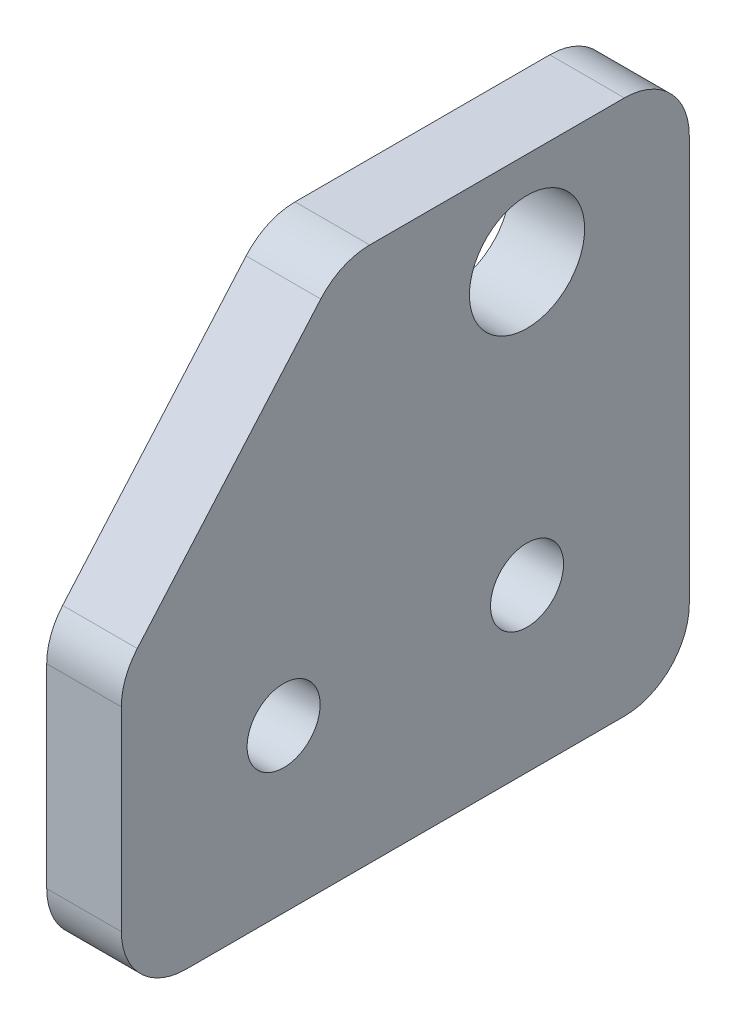
ISO-10303-21;
HEADER;
FILE_DESCRIPTION(('STEP AP214'),'2;1');
FILE_NAME('part.step','',(''),(''),'','','');
FILE_SCHEMA(('AUTOMOTIVE_DESIGN { 1 0 10303 214 1 1 1 1 }'));
ENDSEC;
DATA;
#1=APPLICATION_CONTEXT('core data for automotive mechanical design processes');
#2=APPLICATION_PROTOCOL_DEFINITION('international standard','automotive_design',2000,#1);
#3=PRODUCT_CONTEXT('',#1,'mechanical');
#4=PRODUCT('Part','Part','',(#3));
#5=PRODUCT_RELATED_PRODUCT_CATEGORY('part','',(#4));
#6=PRODUCT_DEFINITION_FORMATION('','',#4);
#7=PRODUCT_DEFINITION_CONTEXT('part definition',#1,'design');
#8=PRODUCT_DEFINITION('design','',#6,#7);
#9=PRODUCT_DEFINITION_SHAPE('','',#8);
#10=(LENGTH_UNIT() NAMED_UNIT(*) SI_UNIT(.MILLI.,.METRE.));
#11=(NAMED_UNIT(*) PLANE_ANGLE_UNIT() SI_UNIT($,.RADIAN.));
#12=(NAMED_UNIT(*) SI_UNIT($,.STERADIAN.) SOLID_ANGLE_UNIT());
#13=UNCERTAINTY_MEASURE_WITH_UNIT(LENGTH_MEASURE(1.E-05),#10,'distance_accuracy_value','');
#14=(GEOMETRIC_REPRESENTATION_CONTEXT(3) GLOBAL_UNCERTAINTY_ASSIGNED_CONTEXT((#13)) GLOBAL_UNIT_ASSIGNED_CONTEXT((#10,
#11,#12)) REPRESENTATION_CONTEXT('',''));
#15=CARTESIAN_POINT('',(0.,0.,0.));
#16=DIRECTION('',(0.,0.,1.));
#17=DIRECTION('',(1.,0.,0.));
#18=AXIS2_PLACEMENT_3D('',#15,#16,#17);
#19=CARTESIAN_POINT('',(4.6,-6.,21.));
#20=DIRECTION('',(1.,0.,0.));
#21=DIRECTION('',(0.,0.,-1.));
#22=AXIS2_PLACEMENT_3D('',#19,#20,#21);
#23=PLANE('',#22);
#24=CARTESIAN_POINT('',(4.6,17.25,0.));
#25=DIRECTION('',(1.,0.,0.));
#26=DIRECTION('',(0.,0.,-1.));
#27=AXIS2_PLACEMENT_3D('',#24,#25,#26);
#28=CIRCLE('',#27,3.55);
#29=CARTESIAN_POINT('',(4.6,17.25,-3.55));
#30=VERTEX_POINT('',#29);
#31=EDGE_CURVE('E249',#30,#30,#28,.T.);
#32=ORIENTED_EDGE('',*,*,#31,.F.);
#33=EDGE_LOOP('',(#32));
#34=FACE_BOUND('',#33,.T.);
#35=CARTESIAN_POINT('',(4.6,-6.,21.));
#36=DIRECTION('',(1.,0.,0.));
#37=DIRECTION('',(0.,0.,-1.));
#38=AXIS2_PLACEMENT_3D('',#35,#36,#37);
#39=CIRCLE('',#38,4.);
#40=CARTESIAN_POINT('',(4.6,-6.,25.));
#41=VERTEX_POINT('',#40);
#42=CARTESIAN_POINT('',(4.6,-10.,21.));
#43=VERTEX_POINT('',#42);
#44=EDGE_CURVE('E182',#41,#43,#39,.T.);
#45=ORIENTED_EDGE('',*,*,#44,.T.);
#46=DIRECTION('',(0.,0.,-1.));
#47=VECTOR('',#46,1.);
#48=CARTESIAN_POINT('',(4.6,-10.,21.));
#49=LINE('',#48,#47);
#50=CARTESIAN_POINT('',(4.6,-10.,-6.));
#51=VERTEX_POINT('',#50);
#52=EDGE_CURVE('E106',#43,#51,#49,.T.);
#53=ORIENTED_EDGE('',*,*,#52,.T.);
#54=CARTESIAN_POINT('',(4.6,-6.,-6.));
#55=DIRECTION('',(1.,0.,0.));
#56=DIRECTION('',(0.,0.,-1.));
#57=AXIS2_PLACEMENT_3D('',#54,#55,#56);
#58=CIRCLE('',#57,4.);
#59=CARTESIAN_POINT('',(4.6,-6.,-10.));
#60=VERTEX_POINT('',#59);
#61=EDGE_CURVE('E211',#51,#60,#58,.T.);
#62=ORIENTED_EDGE('',*,*,#61,.T.);
#63=DIRECTION('',(0.,1.,0.));
#64=VECTOR('',#63,1.);
#65=CARTESIAN_POINT('',(4.6,-6.,-10.));
#66=LINE('',#65,#64);
#67=CARTESIAN_POINT('',(4.6,19.,-10.));
#68=VERTEX_POINT('',#67);
#69=EDGE_CURVE('E231',#60,#68,#66,.T.);
#70=ORIENTED_EDGE('',*,*,#69,.T.);
#71=CARTESIAN_POINT('',(4.6,19.,-6.));
#72=DIRECTION('',(1.,0.,0.));
#73=DIRECTION('',(0.,0.,-1.));
#74=AXIS2_PLACEMENT_3D('',#71,#72,#73);
#75=CIRCLE('',#74,4.);
#76=CARTESIAN_POINT('',(4.6,23.,-6.));
#77=VERTEX_POINT('',#76);
#78=EDGE_CURVE('E227',#68,#77,#75,.T.);
#79=ORIENTED_EDGE('',*,*,#78,.T.);
#80=DIRECTION('',(0.,0.,1.));
#81=VECTOR('',#80,1.);
#82=CARTESIAN_POINT('',(4.6,23.,-6.));
#83=LINE('',#82,#81);
#84=CARTESIAN_POINT('',(4.6,23.,9.69565217391305));
#85=VERTEX_POINT('',#84);
#86=EDGE_CURVE('E230',#77,#85,#83,.T.);
#87=ORIENTED_EDGE('',*,*,#86,.T.);
#88=CARTESIAN_POINT('',(4.6,19.,9.69565217391305));
#89=DIRECTION('',(1.,0.,0.));
#90=DIRECTION('',(0.,0.,-1.));
#91=AXIS2_PLACEMENT_3D('',#88,#89,#90);
#92=CIRCLE('',#91,4.);
#93=CARTESIAN_POINT('',(4.6,21.6247148596991,12.7140742625671));
#94=VERTEX_POINT('',#93);
#95=EDGE_CURVE('E131',#85,#94,#92,.T.);
#96=ORIENTED_EDGE('',*,*,#95,.T.);
#97=DIRECTION('',(0.,-0.754605522163505,0.656178714924786));
#98=VECTOR('',#97,1.);
#99=CARTESIAN_POINT('',(4.6,21.6247148596991,12.7140742625671));
#100=LINE('',#99,#98);
#101=CARTESIAN_POINT('',(4.6,8.62471485969914,24.018422088654));
#102=VERTEX_POINT('',#101);
#103=EDGE_CURVE('E125',#94,#102,#100,.T.);
#104=ORIENTED_EDGE('',*,*,#103,.T.);
#105=CARTESIAN_POINT('',(4.6,5.99999999999999,21.));
#106=DIRECTION('',(1.,0.,0.));
#107=DIRECTION('',(0.,0.,-1.));
#108=AXIS2_PLACEMENT_3D('',#105,#106,#107);
#109=CIRCLE('',#108,4.);
#110=CARTESIAN_POINT('',(4.6,5.99999999999999,25.));
#111=VERTEX_POINT('',#110);
#112=EDGE_CURVE('E129',#102,#111,#109,.T.);
#113=ORIENTED_EDGE('',*,*,#112,.T.);
#114=DIRECTION('',(0.,-1.,0.));
#115=VECTOR('',#114,1.);
#116=CARTESIAN_POINT('',(4.6,5.99999999999999,25.));
#117=LINE('',#116,#115);
#118=EDGE_CURVE('E57',#111,#41,#117,.T.);
#119=ORIENTED_EDGE('',*,*,#118,.T.);
#120=EDGE_LOOP('',(#45,#53,#62,#70,#79,#87,#96,#104,#113,#119));
#121=FACE_BOUND('',#120,.T.);
#122=CARTESIAN_POINT('',(4.6,0.,15.));
#123=DIRECTION('',(1.,0.,0.));
#124=DIRECTION('',(0.,0.,-1.));
#125=AXIS2_PLACEMENT_3D('',#122,#123,#124);
#126=CIRCLE('',#125,2.25);
#127=CARTESIAN_POINT('',(4.6,0.,12.75));
#128=VERTEX_POINT('',#127);
#129=EDGE_CURVE('E158',#128,#128,#126,.T.);
#130=ORIENTED_EDGE('',*,*,#129,.F.);
#131=EDGE_LOOP('',(#130));
#132=FACE_BOUND('',#131,.T.);
#133=CARTESIAN_POINT('',(4.6,0.,0.));
#134=DIRECTION('',(1.,0.,0.));
#135=DIRECTION('',(0.,0.,-1.));
#136=AXIS2_PLACEMENT_3D('',#133,#134,#135);
#137=CIRCLE('',#136,2.25);
#138=CARTESIAN_POINT('',(4.6,0.,-2.25));
#139=VERTEX_POINT('',#138);
#140=EDGE_CURVE('E257',#139,#139,#137,.T.);
#141=ORIENTED_EDGE('',*,*,#140,.F.);
#142=EDGE_LOOP('',(#141));
#143=FACE_BOUND('',#142,.T.);
#144=ADVANCED_FACE('F39',(#34,#121,#132,#143),#23,.T.);
#145=CARTESIAN_POINT('',(0.,-6.,21.));
#146=DIRECTION('',(1.,0.,0.));
#147=DIRECTION('',(0.,0.,-1.));
#148=AXIS2_PLACEMENT_3D('',#145,#146,#147);
#149=PLANE('',#148);
#150=CARTESIAN_POINT('',(0.,-6.,21.));
#151=DIRECTION('',(1.,0.,0.));
#152=DIRECTION('',(0.,0.,-1.));
#153=AXIS2_PLACEMENT_3D('',#150,#151,#152);
#154=CIRCLE('',#153,4.);
#155=CARTESIAN_POINT('',(0.,-6.,25.));
#156=VERTEX_POINT('',#155);
#157=CARTESIAN_POINT('',(0.,-10.,21.));
#158=VERTEX_POINT('',#157);
#159=EDGE_CURVE('E153',#156,#158,#154,.T.);
#160=ORIENTED_EDGE('',*,*,#159,.F.);
#161=DIRECTION('',(0.,-1.,0.));
#162=VECTOR('',#161,1.);
#163=CARTESIAN_POINT('',(0.,5.99999999999999,25.));
#164=LINE('',#163,#162);
#165=CARTESIAN_POINT('',(0.,5.99999999999999,25.));
#166=VERTEX_POINT('',#165);
#167=EDGE_CURVE('E98',#166,#156,#164,.T.);
#168=ORIENTED_EDGE('',*,*,#167,.F.);
#169=CARTESIAN_POINT('',(0.,5.99999999999999,21.));
#170=DIRECTION('',(1.,0.,0.));
#171=DIRECTION('',(0.,0.,-1.));
#172=AXIS2_PLACEMENT_3D('',#169,#170,#171);
#173=CIRCLE('',#172,4.);
#174=CARTESIAN_POINT('',(0.,8.62471485969914,24.018422088654));
#175=VERTEX_POINT('',#174);
#176=EDGE_CURVE('E92',#175,#166,#173,.T.);
#177=ORIENTED_EDGE('',*,*,#176,.F.);
#178=DIRECTION('',(0.,-0.754605522163505,0.656178714924786));
#179=VECTOR('',#178,1.);
#180=CARTESIAN_POINT('',(0.,21.6247148596991,12.7140742625671));
#181=LINE('',#180,#179);
#182=CARTESIAN_POINT('',(0.,21.6247148596991,12.7140742625671));
#183=VERTEX_POINT('',#182);
#184=EDGE_CURVE('E140',#183,#175,#181,.T.);
#185=ORIENTED_EDGE('',*,*,#184,.F.);
#186=CARTESIAN_POINT('',(0.,19.,9.69565217391305));
#187=DIRECTION('',(1.,0.,0.));
#188=DIRECTION('',(0.,0.,-1.));
#189=AXIS2_PLACEMENT_3D('',#186,#187,#188);
#190=CIRCLE('',#189,4.);
#191=CARTESIAN_POINT('',(0.,23.,9.69565217391305));
#192=VERTEX_POINT('',#191);
#193=EDGE_CURVE('E173',#192,#183,#190,.T.);
#194=ORIENTED_EDGE('',*,*,#193,.F.);
#195=DIRECTION('',(0.,0.,1.));
#196=VECTOR('',#195,1.);
#197=CARTESIAN_POINT('',(0.,23.,-6.));
#198=LINE('',#197,#196);
#199=CARTESIAN_POINT('',(0.,23.,-6.));
#200=VERTEX_POINT('',#199);
#201=EDGE_CURVE('E170',#200,#192,#198,.T.);
#202=ORIENTED_EDGE('',*,*,#201,.F.);
#203=CARTESIAN_POINT('',(0.,19.,-6.));
#204=DIRECTION('',(1.,0.,0.));
#205=DIRECTION('',(0.,0.,-1.));
#206=AXIS2_PLACEMENT_3D('',#203,#204,#205);
#207=CIRCLE('',#206,4.);
#208=CARTESIAN_POINT('',(0.,19.,-10.));
#209=VERTEX_POINT('',#208);
#210=EDGE_CURVE('E167',#209,#200,#207,.T.);
#211=ORIENTED_EDGE('',*,*,#210,.F.);
#212=DIRECTION('',(0.,1.,0.));
#213=VECTOR('',#212,1.);
#214=CARTESIAN_POINT('',(0.,-6.,-10.));
#215=LINE('',#214,#213);
#216=CARTESIAN_POINT('',(0.,-6.,-10.));
#217=VERTEX_POINT('',#216);
#218=EDGE_CURVE('E164',#217,#209,#215,.T.);
#219=ORIENTED_EDGE('',*,*,#218,.F.);
#220=CARTESIAN_POINT('',(0.,-6.,-6.));
#221=DIRECTION('',(1.,0.,0.));
#222=DIRECTION('',(0.,0.,-1.));
#223=AXIS2_PLACEMENT_3D('',#220,#221,#222);
#224=CIRCLE('',#223,4.);
#225=CARTESIAN_POINT('',(0.,-10.,-6.));
#226=VERTEX_POINT('',#225);
#227=EDGE_CURVE('E161',#226,#217,#224,.T.);
#228=ORIENTED_EDGE('',*,*,#227,.F.);
#229=DIRECTION('',(0.,0.,-1.));
#230=VECTOR('',#229,1.);
#231=CARTESIAN_POINT('',(0.,-10.,21.));
#232=LINE('',#231,#230);
#233=EDGE_CURVE('E157',#158,#226,#232,.T.);
#234=ORIENTED_EDGE('',*,*,#233,.F.);
#235=EDGE_LOOP('',(#160,#168,#177,#185,#194,#202,#211,#219,#228,#234));
#236=FACE_BOUND('',#235,.T.);
#237=CARTESIAN_POINT('',(0.,0.,15.));
#238=DIRECTION('',(1.,0.,0.));
#239=DIRECTION('',(0.,0.,-1.));
#240=AXIS2_PLACEMENT_3D('',#237,#238,#239);
#241=CIRCLE('',#240,2.25);
#242=CARTESIAN_POINT('',(0.,0.,12.75));
#243=VERTEX_POINT('',#242);
#244=EDGE_CURVE('E245',#243,#243,#241,.T.);
#245=ORIENTED_EDGE('',*,*,#244,.T.);
#246=EDGE_LOOP('',(#245));
#247=FACE_BOUND('',#246,.T.);
#248=CARTESIAN_POINT('',(0.,17.25,0.));
#249=DIRECTION('',(1.,0.,0.));
#250=DIRECTION('',(0.,0.,-1.));
#251=AXIS2_PLACEMENT_3D('',#248,#249,#250);
#252=CIRCLE('',#251,3.55);
#253=CARTESIAN_POINT('',(0.,17.25,-3.55));
#254=VERTEX_POINT('',#253);
#255=EDGE_CURVE('E253',#254,#254,#252,.T.);
#256=ORIENTED_EDGE('',*,*,#255,.T.);
#257=EDGE_LOOP('',(#256));
#258=FACE_BOUND('',#257,.T.);
#259=CARTESIAN_POINT('',(0.,0.,0.));
#260=DIRECTION('',(1.,0.,0.));
#261=DIRECTION('',(0.,0.,-1.));
#262=AXIS2_PLACEMENT_3D('',#259,#260,#261);
#263=CIRCLE('',#262,2.25);
#264=CARTESIAN_POINT('',(0.,0.,-2.25));
#265=VERTEX_POINT('',#264);
#266=EDGE_CURVE('E261',#265,#265,#263,.T.);
#267=ORIENTED_EDGE('',*,*,#266,.T.);
#268=EDGE_LOOP('',(#267));
#269=FACE_BOUND('',#268,.T.);
#270=ADVANCED_FACE('F215',(#236,#247,#258,#269),#149,.F.);
#271=CARTESIAN_POINT('',(4.6,-6.,21.));
#272=DIRECTION('',(-1.,0.,0.));
#273=DIRECTION('',(0.,0.,1.));
#274=AXIS2_PLACEMENT_3D('',#271,#272,#273);
#275=CYLINDRICAL_SURFACE('',#274,4.);
#276=ORIENTED_EDGE('',*,*,#159,.T.);
#277=DIRECTION('',(-1.,0.,0.));
#278=VECTOR('',#277,1.);
#279=CARTESIAN_POINT('',(4.6,-10.,21.));
#280=LINE('',#279,#278);
#281=EDGE_CURVE('E11',#43,#158,#280,.T.);
#282=ORIENTED_EDGE('',*,*,#281,.F.);
#283=ORIENTED_EDGE('',*,*,#44,.F.);
#284=DIRECTION('',(-1.,0.,0.));
#285=VECTOR('',#284,1.);
#286=CARTESIAN_POINT('',(4.6,-6.,25.));
#287=LINE('',#286,#285);
#288=EDGE_CURVE('E149',#41,#156,#287,.T.);
#289=ORIENTED_EDGE('',*,*,#288,.T.);
#290=EDGE_LOOP('',(#276,#282,#283,#289));
#291=FACE_BOUND('',#290,.T.);
#292=ADVANCED_FACE('F41',(#291),#275,.T.);
#293=CARTESIAN_POINT('',(4.6,-10.,21.));
#294=DIRECTION('',(0.,1.,0.));
#295=DIRECTION('',(0.,0.,1.));
#296=AXIS2_PLACEMENT_3D('',#293,#294,#295);
#297=PLANE('',#296);
#298=ORIENTED_EDGE('',*,*,#233,.T.);
#299=DIRECTION('',(-1.,0.,0.));
#300=VECTOR('',#299,1.);
#301=CARTESIAN_POINT('',(4.6,-10.,-6.));
#302=LINE('',#301,#300);
#303=EDGE_CURVE('E49',#51,#226,#302,.T.);
#304=ORIENTED_EDGE('',*,*,#303,.F.);
#305=ORIENTED_EDGE('',*,*,#52,.F.);
#306=ORIENTED_EDGE('',*,*,#281,.T.);
#307=EDGE_LOOP('',(#298,#304,#305,#306));
#308=FACE_BOUND('',#307,.T.);
#309=ADVANCED_FACE('F304',(#308),#297,.F.);
#310=CARTESIAN_POINT('',(4.6,-6.,-6.));
#311=DIRECTION('',(-1.,0.,0.));
#312=DIRECTION('',(0.,0.,1.));
#313=AXIS2_PLACEMENT_3D('',#310,#311,#312);
#314=CYLINDRICAL_SURFACE('',#313,4.);
#315=ORIENTED_EDGE('',*,*,#227,.T.);
#316=DIRECTION('',(-1.,0.,0.));
#317=VECTOR('',#316,1.);
#318=CARTESIAN_POINT('',(4.6,-6.,-10.));
#319=LINE('',#318,#317);
#320=EDGE_CURVE('E201',#60,#217,#319,.T.);
#321=ORIENTED_EDGE('',*,*,#320,.F.);
#322=ORIENTED_EDGE('',*,*,#61,.F.);
#323=ORIENTED_EDGE('',*,*,#303,.T.);
#324=EDGE_LOOP('',(#315,#321,#322,#323));
#325=FACE_BOUND('',#324,.T.);
#326=ADVANCED_FACE('F209',(#325),#314,.T.);
#327=CARTESIAN_POINT('',(4.6,-6.,-10.));
#328=DIRECTION('',(0.,0.,1.));
#329=DIRECTION('',(0.,-1.,0.));
#330=AXIS2_PLACEMENT_3D('',#327,#328,#329);
#331=PLANE('',#330);
#332=ORIENTED_EDGE('',*,*,#218,.T.);
#333=DIRECTION('',(-1.,0.,0.));
#334=VECTOR('',#333,1.);
#335=CARTESIAN_POINT('',(4.6,19.,-10.));
#336=LINE('',#335,#334);
#337=EDGE_CURVE('E197',#68,#209,#336,.T.);
#338=ORIENTED_EDGE('',*,*,#337,.F.);
#339=ORIENTED_EDGE('',*,*,#69,.F.);
#340=ORIENTED_EDGE('',*,*,#320,.T.);
#341=EDGE_LOOP('',(#332,#338,#339,#340));
#342=FACE_BOUND('',#341,.T.);
#343=ADVANCED_FACE('F221',(#342),#331,.F.);
#344=CARTESIAN_POINT('',(4.6,19.,-6.));
#345=DIRECTION('',(-1.,0.,0.));
#346=DIRECTION('',(0.,0.,1.));
#347=AXIS2_PLACEMENT_3D('',#344,#345,#346);
#348=CYLINDRICAL_SURFACE('',#347,4.);
#349=ORIENTED_EDGE('',*,*,#210,.T.);
#350=DIRECTION('',(-1.,0.,0.));
#351=VECTOR('',#350,1.);
#352=CARTESIAN_POINT('',(4.6,23.,-6.));
#353=LINE('',#352,#351);
#354=EDGE_CURVE('E193',#77,#200,#353,.T.);
#355=ORIENTED_EDGE('',*,*,#354,.F.);
#356=ORIENTED_EDGE('',*,*,#78,.F.);
#357=ORIENTED_EDGE('',*,*,#337,.T.);
#358=EDGE_LOOP('',(#349,#355,#356,#357));
#359=FACE_BOUND('',#358,.T.);
#360=ADVANCED_FACE('F225',(#359),#348,.T.);
#361=CARTESIAN_POINT('',(4.6,23.,-6.));
#362=DIRECTION('',(0.,-1.,0.));
#363=DIRECTION('',(0.,0.,-1.));
#364=AXIS2_PLACEMENT_3D('',#361,#362,#363);
#365=PLANE('',#364);
#366=ORIENTED_EDGE('',*,*,#201,.T.);
#367=DIRECTION('',(-1.,0.,0.));
#368=VECTOR('',#367,1.);
#369=CARTESIAN_POINT('',(4.6,23.,9.69565217391305));
#370=LINE('',#369,#368);
#371=EDGE_CURVE('E189',#85,#192,#370,.T.);
#372=ORIENTED_EDGE('',*,*,#371,.F.);
#373=ORIENTED_EDGE('',*,*,#86,.F.);
#374=ORIENTED_EDGE('',*,*,#354,.T.);
#375=EDGE_LOOP('',(#366,#372,#373,#374));
#376=FACE_BOUND('',#375,.T.);
#377=ADVANCED_FACE('F294',(#376),#365,.F.);
#378=CARTESIAN_POINT('',(4.6,19.,9.69565217391305));
#379=DIRECTION('',(-1.,0.,0.));
#380=DIRECTION('',(0.,0.,1.));
#381=AXIS2_PLACEMENT_3D('',#378,#379,#380);
#382=CYLINDRICAL_SURFACE('',#381,4.);
#383=ORIENTED_EDGE('',*,*,#193,.T.);
#384=DIRECTION('',(-1.,0.,0.));
#385=VECTOR('',#384,1.);
#386=CARTESIAN_POINT('',(4.6,21.6247148596991,12.7140742625671));
#387=LINE('',#386,#385);
#388=EDGE_CURVE('E142',#94,#183,#387,.T.);
#389=ORIENTED_EDGE('',*,*,#388,.F.);
#390=ORIENTED_EDGE('',*,*,#95,.F.);
#391=ORIENTED_EDGE('',*,*,#371,.T.);
#392=EDGE_LOOP('',(#383,#389,#390,#391));
#393=FACE_BOUND('',#392,.T.);
#394=ADVANCED_FACE('F291',(#393),#382,.T.);
#395=CARTESIAN_POINT('',(4.6,21.6247148596991,12.7140742625671));
#396=DIRECTION('',(0.,-0.656178714924786,-0.754605522163505));
#397=DIRECTION('',(0.,0.754605522163505,-0.656178714924786));
#398=AXIS2_PLACEMENT_3D('',#395,#396,#397);
#399=PLANE('',#398);
#400=ORIENTED_EDGE('',*,*,#184,.T.);
#401=DIRECTION('',(-1.,0.,0.));
#402=VECTOR('',#401,1.);
#403=CARTESIAN_POINT('',(4.6,8.62471485969914,24.018422088654));
#404=LINE('',#403,#402);
#405=EDGE_CURVE('E137',#102,#175,#404,.T.);
#406=ORIENTED_EDGE('',*,*,#405,.F.);
#407=ORIENTED_EDGE('',*,*,#103,.F.);
#408=ORIENTED_EDGE('',*,*,#388,.T.);
#409=EDGE_LOOP('',(#400,#406,#407,#408));
#410=FACE_BOUND('',#409,.T.);
#411=ADVANCED_FACE('F138',(#410),#399,.F.);
#412=CARTESIAN_POINT('',(4.6,5.99999999999999,21.));
#413=DIRECTION('',(-1.,0.,0.));
#414=DIRECTION('',(0.,0.,1.));
#415=AXIS2_PLACEMENT_3D('',#412,#413,#414);
#416=CYLINDRICAL_SURFACE('',#415,4.);
#417=ORIENTED_EDGE('',*,*,#176,.T.);
#418=DIRECTION('',(-1.,0.,0.));
#419=VECTOR('',#418,1.);
#420=CARTESIAN_POINT('',(4.6,5.99999999999999,25.));
#421=LINE('',#420,#419);
#422=EDGE_CURVE('E143',#111,#166,#421,.T.);
#423=ORIENTED_EDGE('',*,*,#422,.F.);
#424=ORIENTED_EDGE('',*,*,#112,.F.);
#425=ORIENTED_EDGE('',*,*,#405,.T.);
#426=EDGE_LOOP('',(#417,#423,#424,#425));
#427=FACE_BOUND('',#426,.T.);
#428=ADVANCED_FACE('F145',(#427),#416,.T.);
#429=CARTESIAN_POINT('',(4.6,5.99999999999999,25.));
#430=DIRECTION('',(0.,0.,-1.));
#431=DIRECTION('',(0.,1.,0.));
#432=AXIS2_PLACEMENT_3D('',#429,#430,#431);
#433=PLANE('',#432);
#434=ORIENTED_EDGE('',*,*,#167,.T.);
#435=ORIENTED_EDGE('',*,*,#288,.F.);
#436=ORIENTED_EDGE('',*,*,#118,.F.);
#437=ORIENTED_EDGE('',*,*,#422,.T.);
#438=EDGE_LOOP('',(#434,#435,#436,#437));
#439=FACE_BOUND('',#438,.T.);
#440=ADVANCED_FACE('F284',(#439),#433,.F.);
#441=CARTESIAN_POINT('',(4.6,0.,15.));
#442=DIRECTION('',(-1.,0.,0.));
#443=DIRECTION('',(0.,0.,1.));
#444=AXIS2_PLACEMENT_3D('',#441,#442,#443);
#445=CYLINDRICAL_SURFACE('',#444,2.25);
#446=ORIENTED_EDGE('',*,*,#129,.T.);
#447=EDGE_LOOP('',(#446));
#448=FACE_BOUND('',#447,.T.);
#449=ORIENTED_EDGE('',*,*,#244,.F.);
#450=EDGE_LOOP('',(#449));
#451=FACE_BOUND('',#450,.T.);
#452=ADVANCED_FACE('F281',(#448,#451),#445,.F.);
#453=CARTESIAN_POINT('',(4.6,17.25,0.));
#454=DIRECTION('',(-1.,0.,0.));
#455=DIRECTION('',(0.,0.,1.));
#456=AXIS2_PLACEMENT_3D('',#453,#454,#455);
#457=CYLINDRICAL_SURFACE('',#456,3.55);
#458=ORIENTED_EDGE('',*,*,#31,.T.);
#459=EDGE_LOOP('',(#458));
#460=FACE_BOUND('',#459,.T.);
#461=ORIENTED_EDGE('',*,*,#255,.F.);
#462=EDGE_LOOP('',(#461));
#463=FACE_BOUND('',#462,.T.);
#464=ADVANCED_FACE('F380',(#460,#463),#457,.F.);
#465=CARTESIAN_POINT('',(4.6,0.,0.));
#466=DIRECTION('',(-1.,0.,0.));
#467=DIRECTION('',(0.,0.,1.));
#468=AXIS2_PLACEMENT_3D('',#465,#466,#467);
#469=CYLINDRICAL_SURFACE('',#468,2.25);
#470=ORIENTED_EDGE('',*,*,#140,.T.);
#471=EDGE_LOOP('',(#470));
#472=FACE_BOUND('',#471,.T.);
#473=ORIENTED_EDGE('',*,*,#266,.F.);
#474=EDGE_LOOP('',(#473));
#475=FACE_BOUND('',#474,.T.);
#476=ADVANCED_FACE('F269',(#472,#475),#469,.F.);
#477=CLOSED_SHELL('',(#144,#270,#292,#309,#326,#343,#360,#377,#394,#411,#428,#440,#452,#464,#476));
#478=MANIFOLD_SOLID_BREP('B2',#477);
#479=ADVANCED_BREP_SHAPE_REPRESENTATION('',(#18,#478),#14);
#480=SHAPE_DEFINITION_REPRESENTATION(#9,#479);
ENDSEC;
END-ISO-10303-21;
